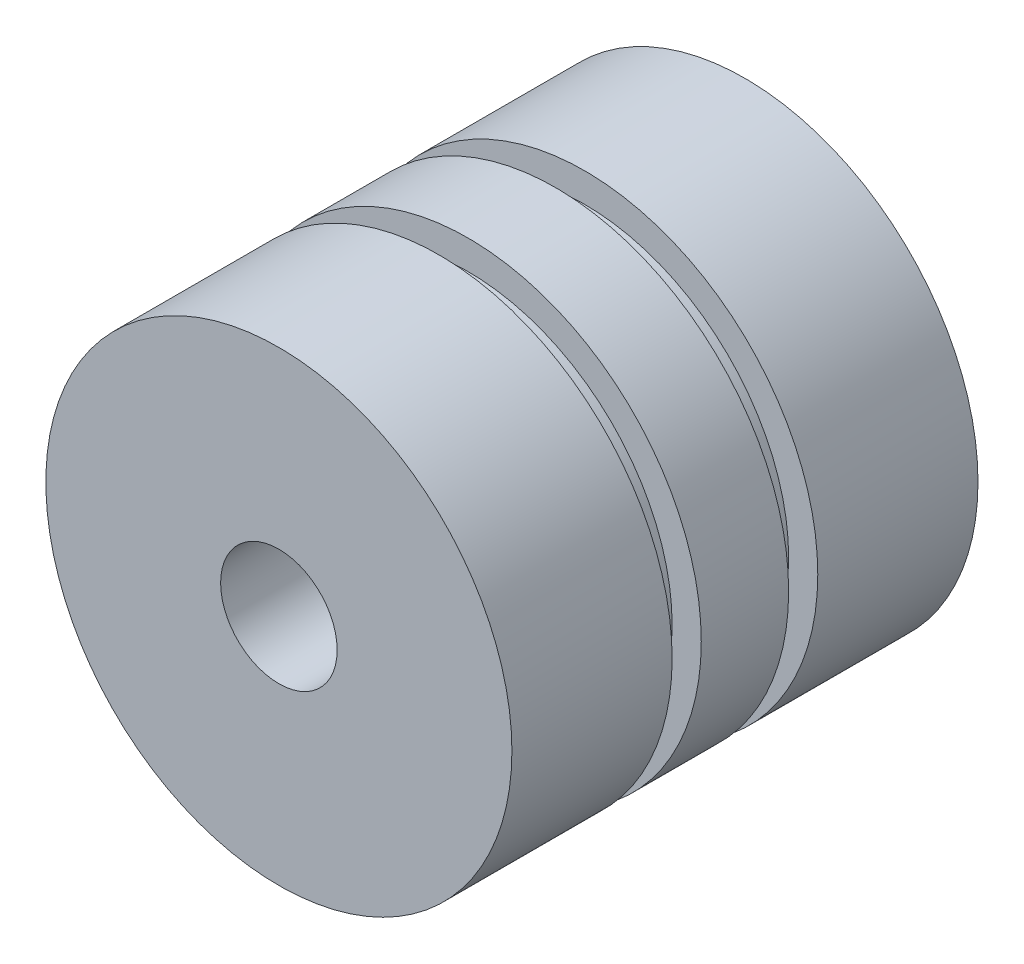
ISO-10303-21;
HEADER;
FILE_DESCRIPTION(('STEP AP214'),'2;1');
FILE_NAME('part.step','',(''),(''),'','','');
FILE_SCHEMA(('AUTOMOTIVE_DESIGN { 1 0 10303 214 1 1 1 1 }'));
ENDSEC;
DATA;
#1=APPLICATION_CONTEXT('core data for automotive mechanical design processes');
#2=APPLICATION_PROTOCOL_DEFINITION('international standard','automotive_design',2000,#1);
#3=PRODUCT_CONTEXT('',#1,'mechanical');
#4=PRODUCT('Part','Part','',(#3));
#5=PRODUCT_RELATED_PRODUCT_CATEGORY('part','',(#4));
#6=PRODUCT_DEFINITION_FORMATION('','',#4);
#7=PRODUCT_DEFINITION_CONTEXT('part definition',#1,'design');
#8=PRODUCT_DEFINITION('design','',#6,#7);
#9=PRODUCT_DEFINITION_SHAPE('','',#8);
#10=(LENGTH_UNIT() NAMED_UNIT(*) SI_UNIT(.MILLI.,.METRE.));
#11=(NAMED_UNIT(*) PLANE_ANGLE_UNIT() SI_UNIT($,.RADIAN.));
#12=(NAMED_UNIT(*) SI_UNIT($,.STERADIAN.) SOLID_ANGLE_UNIT());
#13=UNCERTAINTY_MEASURE_WITH_UNIT(LENGTH_MEASURE(1.E-05),#10,'distance_accuracy_value','');
#14=(GEOMETRIC_REPRESENTATION_CONTEXT(3) GLOBAL_UNCERTAINTY_ASSIGNED_CONTEXT((#13)) GLOBAL_UNIT_ASSIGNED_CONTEXT((#10,
#11,#12)) REPRESENTATION_CONTEXT('',''));
#15=CARTESIAN_POINT('',(0.,0.,0.));
#16=DIRECTION('',(0.,0.,1.));
#17=DIRECTION('',(1.,0.,0.));
#18=AXIS2_PLACEMENT_3D('',#15,#16,#17);
#19=CARTESIAN_POINT('',(0.,0.,16.));
#20=DIRECTION('',(0.,0.,-1.));
#21=DIRECTION('',(-1.,0.,0.));
#22=AXIS2_PLACEMENT_3D('',#19,#20,#21);
#23=CYLINDRICAL_SURFACE('',#22,4.);
#24=CARTESIAN_POINT('',(0.,0.,16.));
#25=DIRECTION('',(0.,0.,1.));
#26=DIRECTION('',(1.,0.,0.));
#27=AXIS2_PLACEMENT_3D('',#24,#25,#26);
#28=CIRCLE('',#27,4.);
#29=CARTESIAN_POINT('',(4.,0.,16.));
#30=VERTEX_POINT('',#29);
#31=EDGE_CURVE('E44',#30,#30,#28,.T.);
#32=ORIENTED_EDGE('',*,*,#31,.T.);
#33=EDGE_LOOP('',(#32));
#34=FACE_BOUND('',#33,.T.);
#35=CARTESIAN_POINT('',(0.,0.,-6.));
#36=DIRECTION('',(0.,0.,-1.));
#37=DIRECTION('',(-1.,0.,0.));
#38=AXIS2_PLACEMENT_3D('',#35,#36,#37);
#39=CIRCLE('',#38,4.);
#40=CARTESIAN_POINT('',(-4.,0.,-6.));
#41=VERTEX_POINT('',#40);
#42=EDGE_CURVE('E35',#41,#41,#39,.T.);
#43=ORIENTED_EDGE('',*,*,#42,.T.);
#44=EDGE_LOOP('',(#43));
#45=FACE_BOUND('',#44,.T.);
#46=ADVANCED_FACE('F31',(#34,#45),#23,.F.);
#47=CARTESIAN_POINT('',(0.,0.,16.));
#48=DIRECTION('',(0.,0.,-1.));
#49=DIRECTION('',(-1.,0.,0.));
#50=AXIS2_PLACEMENT_3D('',#47,#48,#49);
#51=CYLINDRICAL_SURFACE('',#50,16.);
#52=CARTESIAN_POINT('',(0.,0.,-16.));
#53=DIRECTION('',(0.,0.,1.));
#54=DIRECTION('',(1.,0.,0.));
#55=AXIS2_PLACEMENT_3D('',#52,#53,#54);
#56=CIRCLE('',#55,16.);
#57=CARTESIAN_POINT('',(16.,0.,-16.));
#58=VERTEX_POINT('',#57);
#59=EDGE_CURVE('E39',#58,#58,#56,.T.);
#60=ORIENTED_EDGE('',*,*,#59,.T.);
#61=EDGE_LOOP('',(#60));
#62=FACE_BOUND('',#61,.T.);
#63=CARTESIAN_POINT('',(0.,0.,-5.));
#64=DIRECTION('',(0.,0.,1.));
#65=DIRECTION('',(1.,0.,0.));
#66=AXIS2_PLACEMENT_3D('',#63,#64,#65);
#67=CIRCLE('',#66,16.);
#68=CARTESIAN_POINT('',(16.,0.,-5.));
#69=VERTEX_POINT('',#68);
#70=EDGE_CURVE('E58',#69,#69,#67,.T.);
#71=ORIENTED_EDGE('',*,*,#70,.F.);
#72=EDGE_LOOP('',(#71));
#73=FACE_BOUND('',#72,.T.);
#74=ADVANCED_FACE('F94',(#62,#73),#51,.T.);
#75=CARTESIAN_POINT('',(0.,0.,-3.));
#76=DIRECTION('',(0.,0.,1.));
#77=DIRECTION('',(1.,0.,0.));
#78=AXIS2_PLACEMENT_3D('',#75,#76,#77);
#79=CIRCLE('',#78,16.);
#80=CARTESIAN_POINT('',(16.,0.,-3.));
#81=VERTEX_POINT('',#80);
#82=EDGE_CURVE('E61',#81,#81,#79,.T.);
#83=ORIENTED_EDGE('',*,*,#82,.T.);
#84=EDGE_LOOP('',(#83));
#85=FACE_BOUND('',#84,.T.);
#86=CARTESIAN_POINT('',(0.,0.,3.));
#87=DIRECTION('',(0.,0.,1.));
#88=DIRECTION('',(1.,0.,0.));
#89=AXIS2_PLACEMENT_3D('',#86,#87,#88);
#90=CIRCLE('',#89,16.);
#91=CARTESIAN_POINT('',(16.,0.,3.));
#92=VERTEX_POINT('',#91);
#93=EDGE_CURVE('E48',#92,#92,#90,.T.);
#94=ORIENTED_EDGE('',*,*,#93,.F.);
#95=EDGE_LOOP('',(#94));
#96=FACE_BOUND('',#95,.T.);
#97=ADVANCED_FACE('F100',(#85,#96),#51,.T.);
#98=CARTESIAN_POINT('',(0.,0.,16.));
#99=DIRECTION('',(0.,0.,1.));
#100=DIRECTION('',(1.,0.,0.));
#101=AXIS2_PLACEMENT_3D('',#98,#99,#100);
#102=PLANE('',#101);
#103=CARTESIAN_POINT('',(0.,0.,16.));
#104=DIRECTION('',(0.,0.,1.));
#105=DIRECTION('',(1.,0.,0.));
#106=AXIS2_PLACEMENT_3D('',#103,#104,#105);
#107=CIRCLE('',#106,16.);
#108=CARTESIAN_POINT('',(16.,0.,16.));
#109=VERTEX_POINT('',#108);
#110=EDGE_CURVE('E10',#109,#109,#107,.T.);
#111=ORIENTED_EDGE('',*,*,#110,.T.);
#112=EDGE_LOOP('',(#111));
#113=FACE_BOUND('',#112,.T.);
#114=ORIENTED_EDGE('',*,*,#31,.F.);
#115=EDGE_LOOP('',(#114));
#116=FACE_BOUND('',#115,.T.);
#117=ADVANCED_FACE('F106',(#113,#116),#102,.T.);
#118=CARTESIAN_POINT('',(0.,0.,-16.));
#119=DIRECTION('',(0.,0.,1.));
#120=DIRECTION('',(1.,0.,0.));
#121=AXIS2_PLACEMENT_3D('',#118,#119,#120);
#122=PLANE('',#121);
#123=CARTESIAN_POINT('',(0.,0.,-16.));
#124=DIRECTION('',(0.,0.,-1.));
#125=DIRECTION('',(-1.,0.,0.));
#126=AXIS2_PLACEMENT_3D('',#123,#124,#125);
#127=CIRCLE('',#126,5.45);
#128=CARTESIAN_POINT('',(-5.45,0.,-16.));
#129=VERTEX_POINT('',#128);
#130=EDGE_CURVE('E72',#129,#129,#127,.T.);
#131=ORIENTED_EDGE('',*,*,#130,.F.);
#132=EDGE_LOOP('',(#131));
#133=FACE_BOUND('',#132,.T.);
#134=ORIENTED_EDGE('',*,*,#59,.F.);
#135=EDGE_LOOP('',(#134));
#136=FACE_BOUND('',#135,.T.);
#137=ADVANCED_FACE('F108',(#133,#136),#122,.F.);
#138=CARTESIAN_POINT('',(0.,0.,5.));
#139=DIRECTION('',(0.,0.,1.));
#140=DIRECTION('',(1.,0.,0.));
#141=AXIS2_PLACEMENT_3D('',#138,#139,#140);
#142=CIRCLE('',#141,16.);
#143=CARTESIAN_POINT('',(16.,0.,5.));
#144=VERTEX_POINT('',#143);
#145=EDGE_CURVE('E49',#144,#144,#142,.T.);
#146=ORIENTED_EDGE('',*,*,#145,.T.);
#147=EDGE_LOOP('',(#146));
#148=FACE_BOUND('',#147,.T.);
#149=ORIENTED_EDGE('',*,*,#110,.F.);
#150=EDGE_LOOP('',(#149));
#151=FACE_BOUND('',#150,.T.);
#152=ADVANCED_FACE('F33',(#148,#151),#51,.T.);
#153=CARTESIAN_POINT('',(0.,0.,3.));
#154=DIRECTION('',(0.,0.,1.));
#155=DIRECTION('',(1.,0.,0.));
#156=AXIS2_PLACEMENT_3D('',#153,#154,#155);
#157=PLANE('',#156);
#158=CARTESIAN_POINT('',(0.,0.,3.));
#159=DIRECTION('',(0.,0.,1.));
#160=DIRECTION('',(1.,0.,0.));
#161=AXIS2_PLACEMENT_3D('',#158,#159,#160);
#162=CIRCLE('',#161,14.);
#163=CARTESIAN_POINT('',(14.,0.,3.));
#164=VERTEX_POINT('',#163);
#165=EDGE_CURVE('E52',#164,#164,#162,.T.);
#166=ORIENTED_EDGE('',*,*,#165,.F.);
#167=EDGE_LOOP('',(#166));
#168=FACE_BOUND('',#167,.T.);
#169=ORIENTED_EDGE('',*,*,#93,.T.);
#170=EDGE_LOOP('',(#169));
#171=FACE_BOUND('',#170,.T.);
#172=ADVANCED_FACE('F114',(#168,#171),#157,.T.);
#173=CARTESIAN_POINT('',(0.,0.,5.));
#174=DIRECTION('',(0.,0.,1.));
#175=DIRECTION('',(1.,0.,0.));
#176=AXIS2_PLACEMENT_3D('',#173,#174,#175);
#177=PLANE('',#176);
#178=CARTESIAN_POINT('',(0.,0.,5.));
#179=DIRECTION('',(0.,0.,1.));
#180=DIRECTION('',(1.,0.,0.));
#181=AXIS2_PLACEMENT_3D('',#178,#179,#180);
#182=CIRCLE('',#181,14.);
#183=CARTESIAN_POINT('',(14.,0.,5.));
#184=VERTEX_POINT('',#183);
#185=EDGE_CURVE('E55',#184,#184,#182,.T.);
#186=ORIENTED_EDGE('',*,*,#185,.T.);
#187=EDGE_LOOP('',(#186));
#188=FACE_BOUND('',#187,.T.);
#189=ORIENTED_EDGE('',*,*,#145,.F.);
#190=EDGE_LOOP('',(#189));
#191=FACE_BOUND('',#190,.T.);
#192=ADVANCED_FACE('F104',(#188,#191),#177,.F.);
#193=CARTESIAN_POINT('',(0.,0.,3.));
#194=DIRECTION('',(0.,0.,1.));
#195=DIRECTION('',(1.,0.,0.));
#196=AXIS2_PLACEMENT_3D('',#193,#194,#195);
#197=CYLINDRICAL_SURFACE('',#196,14.);
#198=ORIENTED_EDGE('',*,*,#165,.T.);
#199=EDGE_LOOP('',(#198));
#200=FACE_BOUND('',#199,.T.);
#201=ORIENTED_EDGE('',*,*,#185,.F.);
#202=EDGE_LOOP('',(#201));
#203=FACE_BOUND('',#202,.T.);
#204=ADVANCED_FACE('F125',(#200,#203),#197,.T.);
#205=CARTESIAN_POINT('',(0.,0.,-5.));
#206=DIRECTION('',(0.,0.,1.));
#207=DIRECTION('',(1.,0.,0.));
#208=AXIS2_PLACEMENT_3D('',#205,#206,#207);
#209=PLANE('',#208);
#210=CARTESIAN_POINT('',(0.,0.,-5.));
#211=DIRECTION('',(0.,0.,1.));
#212=DIRECTION('',(1.,0.,0.));
#213=AXIS2_PLACEMENT_3D('',#210,#211,#212);
#214=CIRCLE('',#213,14.);
#215=CARTESIAN_POINT('',(14.,0.,-5.));
#216=VERTEX_POINT('',#215);
#217=EDGE_CURVE('E64',#216,#216,#214,.T.);
#218=ORIENTED_EDGE('',*,*,#217,.F.);
#219=EDGE_LOOP('',(#218));
#220=FACE_BOUND('',#219,.T.);
#221=ORIENTED_EDGE('',*,*,#70,.T.);
#222=EDGE_LOOP('',(#221));
#223=FACE_BOUND('',#222,.T.);
#224=ADVANCED_FACE('F122',(#220,#223),#209,.T.);
#225=CARTESIAN_POINT('',(0.,0.,-3.));
#226=DIRECTION('',(0.,0.,1.));
#227=DIRECTION('',(1.,0.,0.));
#228=AXIS2_PLACEMENT_3D('',#225,#226,#227);
#229=PLANE('',#228);
#230=CARTESIAN_POINT('',(0.,0.,-3.));
#231=DIRECTION('',(0.,0.,1.));
#232=DIRECTION('',(1.,0.,0.));
#233=AXIS2_PLACEMENT_3D('',#230,#231,#232);
#234=CIRCLE('',#233,14.);
#235=CARTESIAN_POINT('',(14.,0.,-3.));
#236=VERTEX_POINT('',#235);
#237=EDGE_CURVE('E67',#236,#236,#234,.T.);
#238=ORIENTED_EDGE('',*,*,#237,.T.);
#239=EDGE_LOOP('',(#238));
#240=FACE_BOUND('',#239,.T.);
#241=ORIENTED_EDGE('',*,*,#82,.F.);
#242=EDGE_LOOP('',(#241));
#243=FACE_BOUND('',#242,.T.);
#244=ADVANCED_FACE('F124',(#240,#243),#229,.F.);
#245=CARTESIAN_POINT('',(0.,0.,-5.));
#246=DIRECTION('',(0.,0.,1.));
#247=DIRECTION('',(1.,0.,0.));
#248=AXIS2_PLACEMENT_3D('',#245,#246,#247);
#249=CYLINDRICAL_SURFACE('',#248,14.);
#250=ORIENTED_EDGE('',*,*,#217,.T.);
#251=EDGE_LOOP('',(#250));
#252=FACE_BOUND('',#251,.T.);
#253=ORIENTED_EDGE('',*,*,#237,.F.);
#254=EDGE_LOOP('',(#253));
#255=FACE_BOUND('',#254,.T.);
#256=ADVANCED_FACE('F90',(#252,#255),#249,.T.);
#257=CARTESIAN_POINT('',(0.,0.,-6.));
#258=DIRECTION('',(0.,0.,-1.));
#259=DIRECTION('',(-1.,0.,0.));
#260=AXIS2_PLACEMENT_3D('',#257,#258,#259);
#261=CYLINDRICAL_SURFACE('',#260,5.45);
#262=CARTESIAN_POINT('',(0.,0.,-6.));
#263=DIRECTION('',(0.,0.,-1.));
#264=DIRECTION('',(-1.,0.,0.));
#265=AXIS2_PLACEMENT_3D('',#262,#263,#264);
#266=CIRCLE('',#265,5.45);
#267=CARTESIAN_POINT('',(-5.45,0.,-6.));
#268=VERTEX_POINT('',#267);
#269=EDGE_CURVE('E75',#268,#268,#266,.T.);
#270=ORIENTED_EDGE('',*,*,#269,.F.);
#271=EDGE_LOOP('',(#270));
#272=FACE_BOUND('',#271,.T.);
#273=ORIENTED_EDGE('',*,*,#130,.T.);
#274=EDGE_LOOP('',(#273));
#275=FACE_BOUND('',#274,.T.);
#276=ADVANCED_FACE('F85',(#272,#275),#261,.F.);
#277=CARTESIAN_POINT('',(0.,0.,-6.));
#278=DIRECTION('',(0.,0.,-1.));
#279=DIRECTION('',(-1.,0.,0.));
#280=AXIS2_PLACEMENT_3D('',#277,#278,#279);
#281=PLANE('',#280);
#282=ORIENTED_EDGE('',*,*,#42,.F.);
#283=EDGE_LOOP('',(#282));
#284=FACE_BOUND('',#283,.T.);
#285=ORIENTED_EDGE('',*,*,#269,.T.);
#286=EDGE_LOOP('',(#285));
#287=FACE_BOUND('',#286,.T.);
#288=ADVANCED_FACE('F83',(#284,#287),#281,.T.);
#289=CLOSED_SHELL('',(#46,#74,#97,#117,#137,#152,#172,#192,#204,#224,#244,#256,#276,#288));
#290=MANIFOLD_SOLID_BREP('B2',#289);
#291=ADVANCED_BREP_SHAPE_REPRESENTATION('',(#18,#290),#14);
#292=SHAPE_DEFINITION_REPRESENTATION(#9,#291);
ENDSEC;
END-ISO-10303-21;
